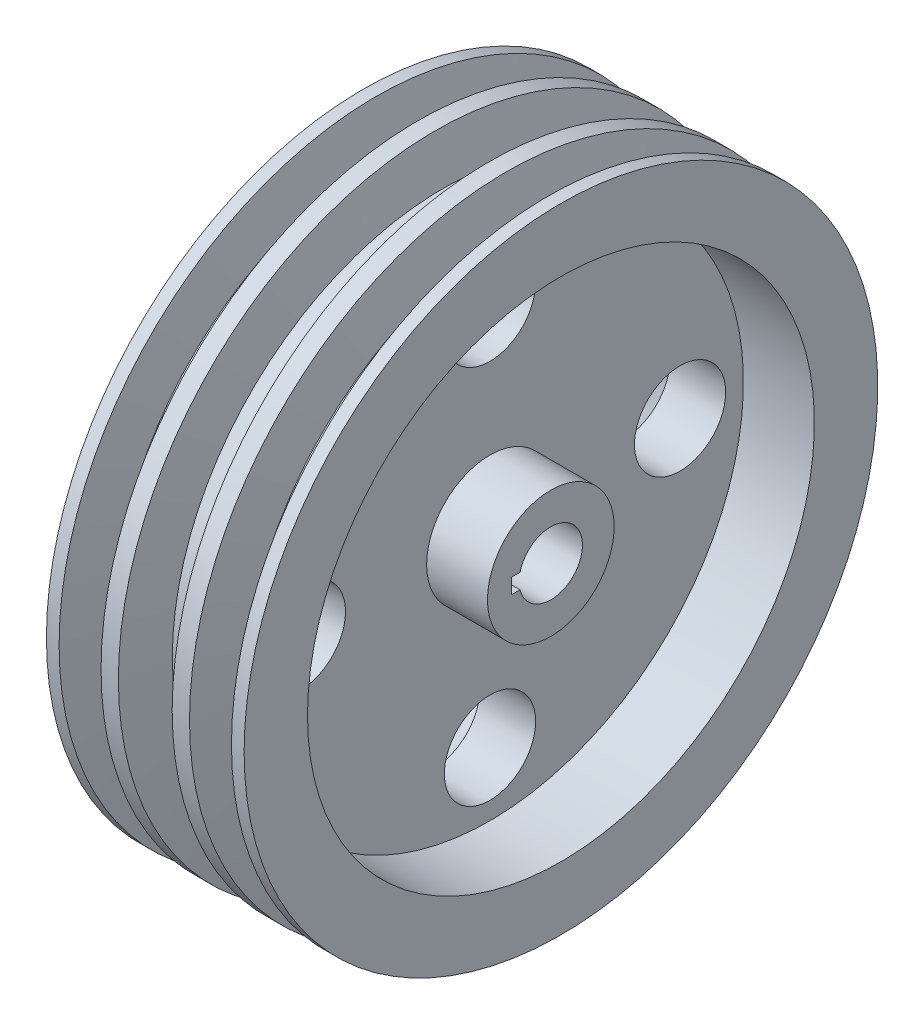
ISO-10303-21;
HEADER;
FILE_DESCRIPTION(('STEP AP214'),'2;1');
FILE_NAME('part.step','',(''),(''),'','','');
FILE_SCHEMA(('AUTOMOTIVE_DESIGN { 1 0 10303 214 1 1 1 1 }'));
ENDSEC;
DATA;
#1=APPLICATION_CONTEXT('core data for automotive mechanical design processes');
#2=APPLICATION_PROTOCOL_DEFINITION('international standard','automotive_design',2000,#1);
#3=PRODUCT_CONTEXT('',#1,'mechanical');
#4=PRODUCT('Part','Part','',(#3));
#5=PRODUCT_RELATED_PRODUCT_CATEGORY('part','',(#4));
#6=PRODUCT_DEFINITION_FORMATION('','',#4);
#7=PRODUCT_DEFINITION_CONTEXT('part definition',#1,'design');
#8=PRODUCT_DEFINITION('design','',#6,#7);
#9=PRODUCT_DEFINITION_SHAPE('','',#8);
#10=(LENGTH_UNIT() NAMED_UNIT(*) SI_UNIT(.MILLI.,.METRE.));
#11=(NAMED_UNIT(*) PLANE_ANGLE_UNIT() SI_UNIT($,.RADIAN.));
#12=(NAMED_UNIT(*) SI_UNIT($,.STERADIAN.) SOLID_ANGLE_UNIT());
#13=UNCERTAINTY_MEASURE_WITH_UNIT(LENGTH_MEASURE(1.E-05),#10,'distance_accuracy_value','');
#14=(GEOMETRIC_REPRESENTATION_CONTEXT(3) GLOBAL_UNCERTAINTY_ASSIGNED_CONTEXT((#13)) GLOBAL_UNIT_ASSIGNED_CONTEXT((#10,
#11,#12)) REPRESENTATION_CONTEXT('',''));
#15=CARTESIAN_POINT('',(0.,0.,0.));
#16=DIRECTION('',(0.,0.,1.));
#17=DIRECTION('',(1.,0.,0.));
#18=AXIS2_PLACEMENT_3D('',#15,#16,#17);
#19=CARTESIAN_POINT('',(17.4485357832083,0.,0.));
#20=DIRECTION('',(-1.,0.,0.));
#21=DIRECTION('',(0.,0.,1.));
#22=AXIS2_PLACEMENT_3D('',#19,#20,#21);
#23=CONICAL_SURFACE('',#22,125.,1.39078123836656);
#24=CARTESIAN_POINT('',(20.7242678916041,0.,0.));
#25=DIRECTION('',(-1.,0.,0.));
#26=DIRECTION('',(0.,0.,1.));
#27=AXIS2_PLACEMENT_3D('',#24,#25,#26);
#28=CIRCLE('',#27,107.);
#29=CARTESIAN_POINT('',(20.7242678916041,0.,107.));
#30=VERTEX_POINT('',#29);
#31=EDGE_CURVE('E105',#30,#30,#28,.T.);
#32=ORIENTED_EDGE('',*,*,#31,.T.);
#33=EDGE_LOOP('',(#32));
#34=FACE_BOUND('',#33,.T.);
#35=CARTESIAN_POINT('',(17.4485357832083,0.,0.));
#36=DIRECTION('',(-1.,0.,0.));
#37=DIRECTION('',(0.,0.,1.));
#38=AXIS2_PLACEMENT_3D('',#35,#36,#37);
#39=CIRCLE('',#38,125.);
#40=CARTESIAN_POINT('',(17.4485357832083,0.,125.));
#41=VERTEX_POINT('',#40);
#42=EDGE_CURVE('E171',#41,#41,#39,.T.);
#43=ORIENTED_EDGE('',*,*,#42,.F.);
#44=EDGE_LOOP('',(#43));
#45=FACE_BOUND('',#44,.T.);
#46=ADVANCED_FACE('F41',(#34,#45),#23,.T.);
#47=CARTESIAN_POINT('',(-121.585294609812,0.,0.));
#48=DIRECTION('',(-1.,0.,0.));
#49=DIRECTION('',(0.,0.,1.));
#50=AXIS2_PLACEMENT_3D('',#47,#48,#49);
#51=CYLINDRICAL_SURFACE('',#50,125.);
#52=ORIENTED_EDGE('',*,*,#42,.T.);
#53=EDGE_LOOP('',(#52));
#54=FACE_BOUND('',#53,.T.);
#55=CARTESIAN_POINT('',(10.6113648581892,0.,0.));
#56=DIRECTION('',(-1.,0.,0.));
#57=DIRECTION('',(0.,0.,1.));
#58=AXIS2_PLACEMENT_3D('',#55,#56,#57);
#59=CIRCLE('',#58,125.);
#60=CARTESIAN_POINT('',(10.6113648581892,0.,125.));
#61=VERTEX_POINT('',#60);
#62=EDGE_CURVE('E166',#61,#61,#59,.T.);
#63=ORIENTED_EDGE('',*,*,#62,.F.);
#64=EDGE_LOOP('',(#63));
#65=FACE_BOUND('',#64,.T.);
#66=ADVANCED_FACE('F228',(#54,#65),#51,.T.);
#67=CARTESIAN_POINT('',(7.33563274979332,0.,0.));
#68=DIRECTION('',(1.,0.,0.));
#69=DIRECTION('',(0.,0.,-1.));
#70=AXIS2_PLACEMENT_3D('',#67,#68,#69);
#71=CONICAL_SURFACE('',#70,107.,1.39078123836655);
#72=ORIENTED_EDGE('',*,*,#62,.T.);
#73=EDGE_LOOP('',(#72));
#74=FACE_BOUND('',#73,.T.);
#75=CARTESIAN_POINT('',(7.33563274979332,0.,0.));
#76=DIRECTION('',(-1.,0.,0.));
#77=DIRECTION('',(0.,0.,1.));
#78=AXIS2_PLACEMENT_3D('',#75,#76,#77);
#79=CIRCLE('',#78,107.);
#80=CARTESIAN_POINT('',(7.33563274979332,0.,107.));
#81=VERTEX_POINT('',#80);
#82=EDGE_CURVE('E167',#81,#81,#79,.T.);
#83=ORIENTED_EDGE('',*,*,#82,.F.);
#84=EDGE_LOOP('',(#83));
#85=FACE_BOUND('',#84,.T.);
#86=ADVANCED_FACE('F233',(#74,#85),#71,.T.);
#87=CARTESIAN_POINT('',(-121.585294609812,0.,0.));
#88=DIRECTION('',(-1.,0.,0.));
#89=DIRECTION('',(0.,0.,1.));
#90=AXIS2_PLACEMENT_3D('',#87,#88,#89);
#91=CYLINDRICAL_SURFACE('',#90,107.);
#92=ORIENTED_EDGE('',*,*,#82,.T.);
#93=EDGE_LOOP('',(#92));
#94=FACE_BOUND('',#93,.T.);
#95=CARTESIAN_POINT('',(-7.33563274979339,0.,0.));
#96=DIRECTION('',(-1.,0.,0.));
#97=DIRECTION('',(0.,0.,1.));
#98=AXIS2_PLACEMENT_3D('',#95,#96,#97);
#99=CIRCLE('',#98,107.);
#100=CARTESIAN_POINT('',(-7.33563274979339,0.,107.));
#101=VERTEX_POINT('',#100);
#102=EDGE_CURVE('E162',#101,#101,#99,.T.);
#103=ORIENTED_EDGE('',*,*,#102,.F.);
#104=EDGE_LOOP('',(#103));
#105=FACE_BOUND('',#104,.T.);
#106=ADVANCED_FACE('F243',(#94,#105),#91,.T.);
#107=CARTESIAN_POINT('',(-7.33563274979339,0.,0.));
#108=DIRECTION('',(-1.,0.,0.));
#109=DIRECTION('',(0.,0.,1.));
#110=AXIS2_PLACEMENT_3D('',#107,#108,#109);
#111=CONICAL_SURFACE('',#110,107.,1.39078123836656);
#112=CARTESIAN_POINT('',(-10.6113648581892,0.,0.));
#113=DIRECTION('',(-1.,0.,0.));
#114=DIRECTION('',(0.,0.,1.));
#115=AXIS2_PLACEMENT_3D('',#112,#113,#114);
#116=CIRCLE('',#115,125.);
#117=CARTESIAN_POINT('',(-10.6113648581892,0.,125.));
#118=VERTEX_POINT('',#117);
#119=EDGE_CURVE('E159',#118,#118,#116,.T.);
#120=ORIENTED_EDGE('',*,*,#119,.F.);
#121=EDGE_LOOP('',(#120));
#122=FACE_BOUND('',#121,.T.);
#123=ORIENTED_EDGE('',*,*,#102,.T.);
#124=EDGE_LOOP('',(#123));
#125=FACE_BOUND('',#124,.T.);
#126=ADVANCED_FACE('F250',(#122,#125),#111,.T.);
#127=CARTESIAN_POINT('',(-121.585294609812,0.,0.));
#128=DIRECTION('',(-1.,0.,0.));
#129=DIRECTION('',(0.,0.,1.));
#130=AXIS2_PLACEMENT_3D('',#127,#128,#129);
#131=CYLINDRICAL_SURFACE('',#130,125.);
#132=CARTESIAN_POINT('',(-17.4485357832083,0.,0.));
#133=DIRECTION('',(-1.,0.,0.));
#134=DIRECTION('',(0.,0.,1.));
#135=AXIS2_PLACEMENT_3D('',#132,#133,#134);
#136=CIRCLE('',#135,125.);
#137=CARTESIAN_POINT('',(-17.4485357832083,0.,125.));
#138=VERTEX_POINT('',#137);
#139=EDGE_CURVE('E160',#138,#138,#136,.T.);
#140=ORIENTED_EDGE('',*,*,#139,.F.);
#141=EDGE_LOOP('',(#140));
#142=FACE_BOUND('',#141,.T.);
#143=ORIENTED_EDGE('',*,*,#119,.T.);
#144=EDGE_LOOP('',(#143));
#145=FACE_BOUND('',#144,.T.);
#146=ADVANCED_FACE('F254',(#142,#145),#131,.T.);
#147=CARTESIAN_POINT('',(-17.4485357832083,0.,0.));
#148=DIRECTION('',(1.,0.,0.));
#149=DIRECTION('',(0.,0.,-1.));
#150=AXIS2_PLACEMENT_3D('',#147,#148,#149);
#151=CONICAL_SURFACE('',#150,125.,1.39078123836656);
#152=CARTESIAN_POINT('',(-20.7242678916041,0.,0.));
#153=DIRECTION('',(-1.,0.,0.));
#154=DIRECTION('',(0.,0.,1.));
#155=AXIS2_PLACEMENT_3D('',#152,#153,#154);
#156=CIRCLE('',#155,107.);
#157=CARTESIAN_POINT('',(-20.7242678916041,0.,107.));
#158=VERTEX_POINT('',#157);
#159=EDGE_CURVE('E152',#158,#158,#156,.T.);
#160=ORIENTED_EDGE('',*,*,#159,.F.);
#161=EDGE_LOOP('',(#160));
#162=FACE_BOUND('',#161,.T.);
#163=ORIENTED_EDGE('',*,*,#139,.T.);
#164=EDGE_LOOP('',(#163));
#165=FACE_BOUND('',#164,.T.);
#166=ADVANCED_FACE('F261',(#162,#165),#151,.T.);
#167=CARTESIAN_POINT('',(-121.585294609812,0.,0.));
#168=DIRECTION('',(-1.,0.,0.));
#169=DIRECTION('',(0.,0.,1.));
#170=AXIS2_PLACEMENT_3D('',#167,#168,#169);
#171=CYLINDRICAL_SURFACE('',#170,107.);
#172=CARTESIAN_POINT('',(-30.7242678916041,0.,0.));
#173=DIRECTION('',(-1.,0.,0.));
#174=DIRECTION('',(0.,0.,1.));
#175=AXIS2_PLACEMENT_3D('',#172,#173,#174);
#176=CIRCLE('',#175,107.);
#177=CARTESIAN_POINT('',(-30.7242678916041,0.,107.));
#178=VERTEX_POINT('',#177);
#179=EDGE_CURVE('E151',#178,#178,#176,.T.);
#180=ORIENTED_EDGE('',*,*,#179,.F.);
#181=EDGE_LOOP('',(#180));
#182=FACE_BOUND('',#181,.T.);
#183=ORIENTED_EDGE('',*,*,#159,.T.);
#184=EDGE_LOOP('',(#183));
#185=FACE_BOUND('',#184,.T.);
#186=ADVANCED_FACE('F268',(#182,#185),#171,.T.);
#187=CARTESIAN_POINT('',(-30.7242678916041,0.,0.));
#188=DIRECTION('',(-1.,0.,0.));
#189=DIRECTION('',(0.,0.,1.));
#190=AXIS2_PLACEMENT_3D('',#187,#188,#189);
#191=CONICAL_SURFACE('',#190,107.,1.39078123836655);
#192=CARTESIAN_POINT('',(-34.,0.,0.));
#193=DIRECTION('',(-1.,0.,0.));
#194=DIRECTION('',(0.,0.,1.));
#195=AXIS2_PLACEMENT_3D('',#192,#193,#194);
#196=CIRCLE('',#195,125.);
#197=CARTESIAN_POINT('',(-34.,0.,125.));
#198=VERTEX_POINT('',#197);
#199=EDGE_CURVE('E146',#198,#198,#196,.T.);
#200=ORIENTED_EDGE('',*,*,#199,.F.);
#201=EDGE_LOOP('',(#200));
#202=FACE_BOUND('',#201,.T.);
#203=ORIENTED_EDGE('',*,*,#179,.T.);
#204=EDGE_LOOP('',(#203));
#205=FACE_BOUND('',#204,.T.);
#206=ADVANCED_FACE('F275',(#202,#205),#191,.T.);
#207=CARTESIAN_POINT('',(-121.585294609812,0.,0.));
#208=DIRECTION('',(-1.,0.,0.));
#209=DIRECTION('',(0.,0.,1.));
#210=AXIS2_PLACEMENT_3D('',#207,#208,#209);
#211=CYLINDRICAL_SURFACE('',#210,125.);
#212=CARTESIAN_POINT('',(-39.,0.,0.));
#213=DIRECTION('',(-1.,0.,0.));
#214=DIRECTION('',(0.,0.,1.));
#215=AXIS2_PLACEMENT_3D('',#212,#213,#214);
#216=CIRCLE('',#215,125.);
#217=CARTESIAN_POINT('',(-39.,0.,125.));
#218=VERTEX_POINT('',#217);
#219=EDGE_CURVE('E144',#218,#218,#216,.T.);
#220=ORIENTED_EDGE('',*,*,#219,.F.);
#221=EDGE_LOOP('',(#220));
#222=FACE_BOUND('',#221,.T.);
#223=ORIENTED_EDGE('',*,*,#199,.T.);
#224=EDGE_LOOP('',(#223));
#225=FACE_BOUND('',#224,.T.);
#226=ADVANCED_FACE('F277',(#222,#225),#211,.T.);
#227=CARTESIAN_POINT('',(-39.,0.,0.));
#228=DIRECTION('',(1.,0.,0.));
#229=DIRECTION('',(0.,0.,-1.));
#230=AXIS2_PLACEMENT_3D('',#227,#228,#229);
#231=PLANE('',#230);
#232=CARTESIAN_POINT('',(-39.,0.,0.));
#233=DIRECTION('',(-1.,0.,0.));
#234=DIRECTION('',(0.,0.,1.));
#235=AXIS2_PLACEMENT_3D('',#232,#233,#234);
#236=CIRCLE('',#235,100.);
#237=CARTESIAN_POINT('',(-39.,0.,100.));
#238=VERTEX_POINT('',#237);
#239=EDGE_CURVE('E142',#238,#238,#236,.T.);
#240=ORIENTED_EDGE('',*,*,#239,.F.);
#241=EDGE_LOOP('',(#240));
#242=FACE_BOUND('',#241,.T.);
#243=ORIENTED_EDGE('',*,*,#219,.T.);
#244=EDGE_LOOP('',(#243));
#245=FACE_BOUND('',#244,.T.);
#246=ADVANCED_FACE('F278',(#242,#245),#231,.F.);
#247=CARTESIAN_POINT('',(-121.585294609812,0.,0.));
#248=DIRECTION('',(-1.,0.,0.));
#249=DIRECTION('',(0.,0.,1.));
#250=AXIS2_PLACEMENT_3D('',#247,#248,#249);
#251=CYLINDRICAL_SURFACE('',#250,100.);
#252=CARTESIAN_POINT('',(-11.,0.,0.));
#253=DIRECTION('',(-1.,0.,0.));
#254=DIRECTION('',(0.,0.,1.));
#255=AXIS2_PLACEMENT_3D('',#252,#253,#254);
#256=CIRCLE('',#255,100.);
#257=CARTESIAN_POINT('',(-11.,0.,100.));
#258=VERTEX_POINT('',#257);
#259=EDGE_CURVE('E138',#258,#258,#256,.T.);
#260=ORIENTED_EDGE('',*,*,#259,.F.);
#261=EDGE_LOOP('',(#260));
#262=FACE_BOUND('',#261,.T.);
#263=ORIENTED_EDGE('',*,*,#239,.T.);
#264=EDGE_LOOP('',(#263));
#265=FACE_BOUND('',#264,.T.);
#266=ADVANCED_FACE('F283',(#262,#265),#251,.F.);
#267=CARTESIAN_POINT('',(-11.,0.,0.));
#268=DIRECTION('',(1.,0.,0.));
#269=DIRECTION('',(0.,0.,-1.));
#270=AXIS2_PLACEMENT_3D('',#267,#268,#269);
#271=PLANE('',#270);
#272=CARTESIAN_POINT('',(-11.,75.,0.));
#273=DIRECTION('',(1.,0.,0.));
#274=DIRECTION('',(0.,0.,-1.));
#275=AXIS2_PLACEMENT_3D('',#272,#273,#274);
#276=CIRCLE('',#275,18.);
#277=CARTESIAN_POINT('',(-11.,75.,-18.));
#278=VERTEX_POINT('',#277);
#279=EDGE_CURVE('E88',#278,#278,#276,.T.);
#280=ORIENTED_EDGE('',*,*,#279,.T.);
#281=EDGE_LOOP('',(#280));
#282=FACE_BOUND('',#281,.T.);
#283=CARTESIAN_POINT('',(-11.,7.85583301239705E-13,-75.));
#284=DIRECTION('',(1.,0.,0.));
#285=DIRECTION('',(0.,0.,-1.));
#286=AXIS2_PLACEMENT_3D('',#283,#284,#285);
#287=CIRCLE('',#286,18.);
#288=CARTESIAN_POINT('',(-11.,7.85583301239705E-13,-93.));
#289=VERTEX_POINT('',#288);
#290=EDGE_CURVE('E186',#289,#289,#287,.T.);
#291=ORIENTED_EDGE('',*,*,#290,.T.);
#292=EDGE_LOOP('',(#291));
#293=FACE_BOUND('',#292,.T.);
#294=CARTESIAN_POINT('',(-11.,-75.,-5.2372220082647E-13));
#295=DIRECTION('',(1.,0.,0.));
#296=DIRECTION('',(0.,0.,-1.));
#297=AXIS2_PLACEMENT_3D('',#294,#295,#296);
#298=CIRCLE('',#297,18.);
#299=CARTESIAN_POINT('',(-11.,-75.,-18.0000000000005));
#300=VERTEX_POINT('',#299);
#301=EDGE_CURVE('E181',#300,#300,#298,.T.);
#302=ORIENTED_EDGE('',*,*,#301,.T.);
#303=EDGE_LOOP('',(#302));
#304=FACE_BOUND('',#303,.T.);
#305=CARTESIAN_POINT('',(-11.,-2.61861100413235E-13,75.));
#306=DIRECTION('',(1.,0.,0.));
#307=DIRECTION('',(0.,0.,-1.));
#308=AXIS2_PLACEMENT_3D('',#305,#306,#307);
#309=CIRCLE('',#308,18.);
#310=CARTESIAN_POINT('',(-11.,-2.61861100413235E-13,57.));
#311=VERTEX_POINT('',#310);
#312=EDGE_CURVE('E178',#311,#311,#309,.T.);
#313=ORIENTED_EDGE('',*,*,#312,.T.);
#314=EDGE_LOOP('',(#313));
#315=FACE_BOUND('',#314,.T.);
#316=CARTESIAN_POINT('',(-11.,0.,0.));
#317=DIRECTION('',(-1.,0.,0.));
#318=DIRECTION('',(0.,0.,1.));
#319=AXIS2_PLACEMENT_3D('',#316,#317,#318);
#320=CIRCLE('',#319,25.);
#321=CARTESIAN_POINT('',(-11.,0.,25.));
#322=VERTEX_POINT('',#321);
#323=EDGE_CURVE('E136',#322,#322,#320,.T.);
#324=ORIENTED_EDGE('',*,*,#323,.F.);
#325=EDGE_LOOP('',(#324));
#326=FACE_BOUND('',#325,.T.);
#327=ORIENTED_EDGE('',*,*,#259,.T.);
#328=EDGE_LOOP('',(#327));
#329=FACE_BOUND('',#328,.T.);
#330=ADVANCED_FACE('F211',(#282,#293,#304,#315,#326,#329),#271,.F.);
#331=CARTESIAN_POINT('',(-121.585294609812,0.,0.));
#332=DIRECTION('',(-1.,0.,0.));
#333=DIRECTION('',(0.,0.,1.));
#334=AXIS2_PLACEMENT_3D('',#331,#332,#333);
#335=CYLINDRICAL_SURFACE('',#334,25.);
#336=CARTESIAN_POINT('',(-35.,0.,0.));
#337=DIRECTION('',(-1.,0.,0.));
#338=DIRECTION('',(0.,0.,1.));
#339=AXIS2_PLACEMENT_3D('',#336,#337,#338);
#340=CIRCLE('',#339,25.);
#341=CARTESIAN_POINT('',(-35.,0.,25.));
#342=VERTEX_POINT('',#341);
#343=EDGE_CURVE('E135',#342,#342,#340,.T.);
#344=ORIENTED_EDGE('',*,*,#343,.F.);
#345=EDGE_LOOP('',(#344));
#346=FACE_BOUND('',#345,.T.);
#347=ORIENTED_EDGE('',*,*,#323,.T.);
#348=EDGE_LOOP('',(#347));
#349=FACE_BOUND('',#348,.T.);
#350=ADVANCED_FACE('F292',(#346,#349),#335,.T.);
#351=CARTESIAN_POINT('',(-35.,0.,0.));
#352=DIRECTION('',(1.,0.,0.));
#353=DIRECTION('',(0.,0.,-1.));
#354=AXIS2_PLACEMENT_3D('',#351,#352,#353);
#355=PLANE('',#354);
#356=DIRECTION('',(0.,-1.,0.));
#357=VECTOR('',#356,1.);
#358=CARTESIAN_POINT('',(-35.,0.,15.5));
#359=LINE('',#358,#357);
#360=CARTESIAN_POINT('',(-35.,3.,15.5));
#361=VERTEX_POINT('',#360);
#362=CARTESIAN_POINT('',(-35.,-3.,15.5));
#363=VERTEX_POINT('',#362);
#364=EDGE_CURVE('E78',#361,#363,#359,.T.);
#365=ORIENTED_EDGE('',*,*,#364,.T.);
#366=DIRECTION('',(0.,0.,-1.));
#367=VECTOR('',#366,1.);
#368=CARTESIAN_POINT('',(-35.,-3.,0.));
#369=LINE('',#368,#367);
#370=CARTESIAN_POINT('',(-35.,-3.,12.1346610995116));
#371=VERTEX_POINT('',#370);
#372=EDGE_CURVE('E99',#363,#371,#369,.T.);
#373=ORIENTED_EDGE('',*,*,#372,.T.);
#374=CARTESIAN_POINT('',(-35.,0.,0.));
#375=DIRECTION('',(-1.,0.,0.));
#376=DIRECTION('',(0.,0.,1.));
#377=AXIS2_PLACEMENT_3D('',#374,#375,#376);
#378=CIRCLE('',#377,12.5);
#379=CARTESIAN_POINT('',(-35.,3.,12.1346610995116));
#380=VERTEX_POINT('',#379);
#381=EDGE_CURVE('E97',#380,#371,#378,.T.);
#382=ORIENTED_EDGE('',*,*,#381,.F.);
#383=DIRECTION('',(0.,0.,1.));
#384=VECTOR('',#383,1.);
#385=CARTESIAN_POINT('',(-35.,3.,0.));
#386=LINE('',#385,#384);
#387=EDGE_CURVE('E85',#380,#361,#386,.T.);
#388=ORIENTED_EDGE('',*,*,#387,.T.);
#389=EDGE_LOOP('',(#365,#373,#382,#388));
#390=FACE_BOUND('',#389,.T.);
#391=ORIENTED_EDGE('',*,*,#343,.T.);
#392=EDGE_LOOP('',(#391));
#393=FACE_BOUND('',#392,.T.);
#394=ADVANCED_FACE('F96',(#390,#393),#355,.F.);
#395=CARTESIAN_POINT('',(-121.585294609812,0.,0.));
#396=DIRECTION('',(-1.,0.,0.));
#397=DIRECTION('',(0.,0.,1.));
#398=AXIS2_PLACEMENT_3D('',#395,#396,#397);
#399=CYLINDRICAL_SURFACE('',#398,12.5);
#400=DIRECTION('',(-1.,0.,0.));
#401=VECTOR('',#400,1.);
#402=CARTESIAN_POINT('',(39.,-3.,12.1346610995116));
#403=LINE('',#402,#401);
#404=CARTESIAN_POINT('',(35.,-3.,12.1346610995116));
#405=VERTEX_POINT('',#404);
#406=EDGE_CURVE('E61',#405,#371,#403,.T.);
#407=ORIENTED_EDGE('',*,*,#406,.F.);
#408=CARTESIAN_POINT('',(35.,0.,0.));
#409=DIRECTION('',(-1.,0.,0.));
#410=DIRECTION('',(0.,0.,1.));
#411=AXIS2_PLACEMENT_3D('',#408,#409,#410);
#412=CIRCLE('',#411,12.5);
#413=CARTESIAN_POINT('',(35.,3.,12.1346610995116));
#414=VERTEX_POINT('',#413);
#415=EDGE_CURVE('E129',#414,#405,#412,.T.);
#416=ORIENTED_EDGE('',*,*,#415,.F.);
#417=DIRECTION('',(-1.,0.,0.));
#418=VECTOR('',#417,1.);
#419=CARTESIAN_POINT('',(39.,3.,12.1346610995116));
#420=LINE('',#419,#418);
#421=EDGE_CURVE('E91',#414,#380,#420,.T.);
#422=ORIENTED_EDGE('',*,*,#421,.T.);
#423=ORIENTED_EDGE('',*,*,#381,.T.);
#424=EDGE_LOOP('',(#407,#416,#422,#423));
#425=FACE_BOUND('',#424,.T.);
#426=ADVANCED_FACE('F200',(#425),#399,.F.);
#427=CARTESIAN_POINT('',(35.,0.,0.));
#428=DIRECTION('',(1.,0.,0.));
#429=DIRECTION('',(0.,0.,-1.));
#430=AXIS2_PLACEMENT_3D('',#427,#428,#429);
#431=PLANE('',#430);
#432=DIRECTION('',(0.,0.,-1.));
#433=VECTOR('',#432,1.);
#434=CARTESIAN_POINT('',(35.,-3.,0.));
#435=LINE('',#434,#433);
#436=CARTESIAN_POINT('',(35.,-3.,15.5));
#437=VERTEX_POINT('',#436);
#438=EDGE_CURVE('E11',#437,#405,#435,.T.);
#439=ORIENTED_EDGE('',*,*,#438,.F.);
#440=DIRECTION('',(0.,-1.,0.));
#441=VECTOR('',#440,1.);
#442=CARTESIAN_POINT('',(35.,0.,15.5));
#443=LINE('',#442,#441);
#444=CARTESIAN_POINT('',(35.,3.,15.5));
#445=VERTEX_POINT('',#444);
#446=EDGE_CURVE('E172',#445,#437,#443,.T.);
#447=ORIENTED_EDGE('',*,*,#446,.F.);
#448=DIRECTION('',(0.,0.,1.));
#449=VECTOR('',#448,1.);
#450=CARTESIAN_POINT('',(35.,3.,0.));
#451=LINE('',#450,#449);
#452=EDGE_CURVE('E48',#414,#445,#451,.T.);
#453=ORIENTED_EDGE('',*,*,#452,.F.);
#454=ORIENTED_EDGE('',*,*,#415,.T.);
#455=EDGE_LOOP('',(#439,#447,#453,#454));
#456=FACE_BOUND('',#455,.T.);
#457=CARTESIAN_POINT('',(35.,0.,0.));
#458=DIRECTION('',(-1.,0.,0.));
#459=DIRECTION('',(0.,0.,1.));
#460=AXIS2_PLACEMENT_3D('',#457,#458,#459);
#461=CIRCLE('',#460,25.);
#462=CARTESIAN_POINT('',(35.,0.,25.));
#463=VERTEX_POINT('',#462);
#464=EDGE_CURVE('E127',#463,#463,#461,.T.);
#465=ORIENTED_EDGE('',*,*,#464,.F.);
#466=EDGE_LOOP('',(#465));
#467=FACE_BOUND('',#466,.T.);
#468=ADVANCED_FACE('F195',(#456,#467),#431,.T.);
#469=CARTESIAN_POINT('',(-121.585294609812,0.,0.));
#470=DIRECTION('',(-1.,0.,0.));
#471=DIRECTION('',(0.,0.,1.));
#472=AXIS2_PLACEMENT_3D('',#469,#470,#471);
#473=CYLINDRICAL_SURFACE('',#472,25.);
#474=ORIENTED_EDGE('',*,*,#464,.T.);
#475=EDGE_LOOP('',(#474));
#476=FACE_BOUND('',#475,.T.);
#477=CARTESIAN_POINT('',(11.,0.,0.));
#478=DIRECTION('',(-1.,0.,0.));
#479=DIRECTION('',(0.,0.,1.));
#480=AXIS2_PLACEMENT_3D('',#477,#478,#479);
#481=CIRCLE('',#480,25.);
#482=CARTESIAN_POINT('',(11.,0.,25.));
#483=VERTEX_POINT('',#482);
#484=EDGE_CURVE('E124',#483,#483,#481,.T.);
#485=ORIENTED_EDGE('',*,*,#484,.F.);
#486=EDGE_LOOP('',(#485));
#487=FACE_BOUND('',#486,.T.);
#488=ADVANCED_FACE('F301',(#476,#487),#473,.T.);
#489=CARTESIAN_POINT('',(11.,0.,0.));
#490=DIRECTION('',(1.,0.,0.));
#491=DIRECTION('',(0.,0.,-1.));
#492=AXIS2_PLACEMENT_3D('',#489,#490,#491);
#493=PLANE('',#492);
#494=CARTESIAN_POINT('',(11.,75.,0.));
#495=DIRECTION('',(1.,0.,0.));
#496=DIRECTION('',(0.,0.,-1.));
#497=AXIS2_PLACEMENT_3D('',#494,#495,#496);
#498=CIRCLE('',#497,18.);
#499=CARTESIAN_POINT('',(11.,75.,-18.));
#500=VERTEX_POINT('',#499);
#501=EDGE_CURVE('E190',#500,#500,#498,.T.);
#502=ORIENTED_EDGE('',*,*,#501,.F.);
#503=EDGE_LOOP('',(#502));
#504=FACE_BOUND('',#503,.T.);
#505=CARTESIAN_POINT('',(11.,7.85583301239705E-13,-75.));
#506=DIRECTION('',(1.,0.,0.));
#507=DIRECTION('',(0.,0.,-1.));
#508=AXIS2_PLACEMENT_3D('',#505,#506,#507);
#509=CIRCLE('',#508,18.);
#510=CARTESIAN_POINT('',(11.,7.85583301239705E-13,-93.));
#511=VERTEX_POINT('',#510);
#512=EDGE_CURVE('E184',#511,#511,#509,.T.);
#513=ORIENTED_EDGE('',*,*,#512,.F.);
#514=EDGE_LOOP('',(#513));
#515=FACE_BOUND('',#514,.T.);
#516=CARTESIAN_POINT('',(11.,-75.,-5.2372220082647E-13));
#517=DIRECTION('',(1.,0.,0.));
#518=DIRECTION('',(0.,0.,-1.));
#519=AXIS2_PLACEMENT_3D('',#516,#517,#518);
#520=CIRCLE('',#519,18.);
#521=CARTESIAN_POINT('',(11.,-75.,-18.0000000000005));
#522=VERTEX_POINT('',#521);
#523=EDGE_CURVE('E180',#522,#522,#520,.T.);
#524=ORIENTED_EDGE('',*,*,#523,.F.);
#525=EDGE_LOOP('',(#524));
#526=FACE_BOUND('',#525,.T.);
#527=CARTESIAN_POINT('',(11.,-2.61861100413235E-13,75.));
#528=DIRECTION('',(1.,0.,0.));
#529=DIRECTION('',(0.,0.,-1.));
#530=AXIS2_PLACEMENT_3D('',#527,#528,#529);
#531=CIRCLE('',#530,18.);
#532=CARTESIAN_POINT('',(11.,-2.61861100413235E-13,57.));
#533=VERTEX_POINT('',#532);
#534=EDGE_CURVE('E176',#533,#533,#531,.T.);
#535=ORIENTED_EDGE('',*,*,#534,.F.);
#536=EDGE_LOOP('',(#535));
#537=FACE_BOUND('',#536,.T.);
#538=ORIENTED_EDGE('',*,*,#484,.T.);
#539=EDGE_LOOP('',(#538));
#540=FACE_BOUND('',#539,.T.);
#541=CARTESIAN_POINT('',(11.,0.,0.));
#542=DIRECTION('',(-1.,0.,0.));
#543=DIRECTION('',(0.,0.,1.));
#544=AXIS2_PLACEMENT_3D('',#541,#542,#543);
#545=CIRCLE('',#544,100.);
#546=CARTESIAN_POINT('',(11.,0.,100.));
#547=VERTEX_POINT('',#546);
#548=EDGE_CURVE('E117',#547,#547,#545,.T.);
#549=ORIENTED_EDGE('',*,*,#548,.F.);
#550=EDGE_LOOP('',(#549));
#551=FACE_BOUND('',#550,.T.);
#552=ADVANCED_FACE('F303',(#504,#515,#526,#537,#540,#551),#493,.T.);
#553=CARTESIAN_POINT('',(-121.585294609812,0.,0.));
#554=DIRECTION('',(-1.,0.,0.));
#555=DIRECTION('',(0.,0.,1.));
#556=AXIS2_PLACEMENT_3D('',#553,#554,#555);
#557=CYLINDRICAL_SURFACE('',#556,100.);
#558=ORIENTED_EDGE('',*,*,#548,.T.);
#559=EDGE_LOOP('',(#558));
#560=FACE_BOUND('',#559,.T.);
#561=CARTESIAN_POINT('',(39.,0.,0.));
#562=DIRECTION('',(-1.,0.,0.));
#563=DIRECTION('',(0.,0.,1.));
#564=AXIS2_PLACEMENT_3D('',#561,#562,#563);
#565=CIRCLE('',#564,100.);
#566=CARTESIAN_POINT('',(39.,0.,100.));
#567=VERTEX_POINT('',#566);
#568=EDGE_CURVE('E116',#567,#567,#565,.T.);
#569=ORIENTED_EDGE('',*,*,#568,.F.);
#570=EDGE_LOOP('',(#569));
#571=FACE_BOUND('',#570,.T.);
#572=ADVANCED_FACE('F306',(#560,#571),#557,.F.);
#573=CARTESIAN_POINT('',(39.,0.,0.));
#574=DIRECTION('',(1.,0.,0.));
#575=DIRECTION('',(0.,0.,-1.));
#576=AXIS2_PLACEMENT_3D('',#573,#574,#575);
#577=PLANE('',#576);
#578=ORIENTED_EDGE('',*,*,#568,.T.);
#579=EDGE_LOOP('',(#578));
#580=FACE_BOUND('',#579,.T.);
#581=CARTESIAN_POINT('',(39.,0.,0.));
#582=DIRECTION('',(-1.,0.,0.));
#583=DIRECTION('',(0.,0.,1.));
#584=AXIS2_PLACEMENT_3D('',#581,#582,#583);
#585=CIRCLE('',#584,125.);
#586=CARTESIAN_POINT('',(39.,0.,125.));
#587=VERTEX_POINT('',#586);
#588=EDGE_CURVE('E111',#587,#587,#585,.T.);
#589=ORIENTED_EDGE('',*,*,#588,.F.);
#590=EDGE_LOOP('',(#589));
#591=FACE_BOUND('',#590,.T.);
#592=ADVANCED_FACE('F315',(#580,#591),#577,.T.);
#593=CARTESIAN_POINT('',(-121.585294609812,0.,0.));
#594=DIRECTION('',(-1.,0.,0.));
#595=DIRECTION('',(0.,0.,1.));
#596=AXIS2_PLACEMENT_3D('',#593,#594,#595);
#597=CYLINDRICAL_SURFACE('',#596,125.);
#598=ORIENTED_EDGE('',*,*,#588,.T.);
#599=EDGE_LOOP('',(#598));
#600=FACE_BOUND('',#599,.T.);
#601=CARTESIAN_POINT('',(34.,0.,0.));
#602=DIRECTION('',(-1.,0.,0.));
#603=DIRECTION('',(0.,0.,1.));
#604=AXIS2_PLACEMENT_3D('',#601,#602,#603);
#605=CIRCLE('',#604,125.);
#606=CARTESIAN_POINT('',(34.,0.,125.));
#607=VERTEX_POINT('',#606);
#608=EDGE_CURVE('E112',#607,#607,#605,.T.);
#609=ORIENTED_EDGE('',*,*,#608,.F.);
#610=EDGE_LOOP('',(#609));
#611=FACE_BOUND('',#610,.T.);
#612=ADVANCED_FACE('F316',(#600,#611),#597,.T.);
#613=CARTESIAN_POINT('',(30.7242678916041,0.,0.));
#614=DIRECTION('',(1.,0.,0.));
#615=DIRECTION('',(0.,0.,-1.));
#616=AXIS2_PLACEMENT_3D('',#613,#614,#615);
#617=CONICAL_SURFACE('',#616,107.,1.39078123836655);
#618=ORIENTED_EDGE('',*,*,#608,.T.);
#619=EDGE_LOOP('',(#618));
#620=FACE_BOUND('',#619,.T.);
#621=CARTESIAN_POINT('',(30.7242678916041,0.,0.));
#622=DIRECTION('',(-1.,0.,0.));
#623=DIRECTION('',(0.,0.,1.));
#624=AXIS2_PLACEMENT_3D('',#621,#622,#623);
#625=CIRCLE('',#624,107.);
#626=CARTESIAN_POINT('',(30.7242678916041,0.,107.));
#627=VERTEX_POINT('',#626);
#628=EDGE_CURVE('E107',#627,#627,#625,.T.);
#629=ORIENTED_EDGE('',*,*,#628,.F.);
#630=EDGE_LOOP('',(#629));
#631=FACE_BOUND('',#630,.T.);
#632=ADVANCED_FACE('F319',(#620,#631),#617,.T.);
#633=CARTESIAN_POINT('',(-121.585294609812,0.,0.));
#634=DIRECTION('',(-1.,0.,0.));
#635=DIRECTION('',(0.,0.,1.));
#636=AXIS2_PLACEMENT_3D('',#633,#634,#635);
#637=CYLINDRICAL_SURFACE('',#636,107.);
#638=ORIENTED_EDGE('',*,*,#628,.T.);
#639=EDGE_LOOP('',(#638));
#640=FACE_BOUND('',#639,.T.);
#641=ORIENTED_EDGE('',*,*,#31,.F.);
#642=EDGE_LOOP('',(#641));
#643=FACE_BOUND('',#642,.T.);
#644=ADVANCED_FACE('F322',(#640,#643),#637,.T.);
#645=CARTESIAN_POINT('',(39.,-2.61861100413235E-13,75.));
#646=DIRECTION('',(-1.,0.,0.));
#647=DIRECTION('',(0.,0.,1.));
#648=AXIS2_PLACEMENT_3D('',#645,#646,#647);
#649=CYLINDRICAL_SURFACE('',#648,18.);
#650=ORIENTED_EDGE('',*,*,#534,.T.);
#651=EDGE_LOOP('',(#650));
#652=FACE_BOUND('',#651,.T.);
#653=ORIENTED_EDGE('',*,*,#312,.F.);
#654=EDGE_LOOP('',(#653));
#655=FACE_BOUND('',#654,.T.);
#656=ADVANCED_FACE('F327',(#652,#655),#649,.F.);
#657=CARTESIAN_POINT('',(39.,-75.,-5.2372220082647E-13));
#658=DIRECTION('',(-1.,0.,0.));
#659=DIRECTION('',(0.,0.,1.));
#660=AXIS2_PLACEMENT_3D('',#657,#658,#659);
#661=CYLINDRICAL_SURFACE('',#660,18.);
#662=ORIENTED_EDGE('',*,*,#523,.T.);
#663=EDGE_LOOP('',(#662));
#664=FACE_BOUND('',#663,.T.);
#665=ORIENTED_EDGE('',*,*,#301,.F.);
#666=EDGE_LOOP('',(#665));
#667=FACE_BOUND('',#666,.T.);
#668=ADVANCED_FACE('F221',(#664,#667),#661,.F.);
#669=CARTESIAN_POINT('',(39.,7.85583301239705E-13,-75.));
#670=DIRECTION('',(-1.,0.,0.));
#671=DIRECTION('',(0.,0.,1.));
#672=AXIS2_PLACEMENT_3D('',#669,#670,#671);
#673=CYLINDRICAL_SURFACE('',#672,18.);
#674=ORIENTED_EDGE('',*,*,#512,.T.);
#675=EDGE_LOOP('',(#674));
#676=FACE_BOUND('',#675,.T.);
#677=ORIENTED_EDGE('',*,*,#290,.F.);
#678=EDGE_LOOP('',(#677));
#679=FACE_BOUND('',#678,.T.);
#680=ADVANCED_FACE('F216',(#676,#679),#673,.F.);
#681=CARTESIAN_POINT('',(39.,75.,0.));
#682=DIRECTION('',(-1.,0.,0.));
#683=DIRECTION('',(0.,0.,1.));
#684=AXIS2_PLACEMENT_3D('',#681,#682,#683);
#685=CYLINDRICAL_SURFACE('',#684,18.);
#686=ORIENTED_EDGE('',*,*,#501,.T.);
#687=EDGE_LOOP('',(#686));
#688=FACE_BOUND('',#687,.T.);
#689=ORIENTED_EDGE('',*,*,#279,.F.);
#690=EDGE_LOOP('',(#689));
#691=FACE_BOUND('',#690,.T.);
#692=ADVANCED_FACE('F212',(#688,#691),#685,.F.);
#693=CARTESIAN_POINT('',(39.,-3.,15.5));
#694=DIRECTION('',(0.,-1.,0.));
#695=DIRECTION('',(0.,0.,-1.));
#696=AXIS2_PLACEMENT_3D('',#693,#694,#695);
#697=PLANE('',#696);
#698=DIRECTION('',(-1.,0.,0.));
#699=VECTOR('',#698,1.);
#700=CARTESIAN_POINT('',(39.,-3.,15.5));
#701=LINE('',#700,#699);
#702=EDGE_CURVE('E82',#437,#363,#701,.T.);
#703=ORIENTED_EDGE('',*,*,#702,.F.);
#704=ORIENTED_EDGE('',*,*,#438,.T.);
#705=ORIENTED_EDGE('',*,*,#406,.T.);
#706=ORIENTED_EDGE('',*,*,#372,.F.);
#707=EDGE_LOOP('',(#703,#704,#705,#706));
#708=FACE_BOUND('',#707,.T.);
#709=ADVANCED_FACE('F194',(#708),#697,.F.);
#710=CARTESIAN_POINT('',(39.,3.,15.5));
#711=DIRECTION('',(0.,1.,0.));
#712=DIRECTION('',(0.,0.,1.));
#713=AXIS2_PLACEMENT_3D('',#710,#711,#712);
#714=PLANE('',#713);
#715=ORIENTED_EDGE('',*,*,#421,.F.);
#716=ORIENTED_EDGE('',*,*,#452,.T.);
#717=DIRECTION('',(-1.,0.,0.));
#718=VECTOR('',#717,1.);
#719=CARTESIAN_POINT('',(39.,3.,15.5));
#720=LINE('',#719,#718);
#721=EDGE_CURVE('E54',#445,#361,#720,.T.);
#722=ORIENTED_EDGE('',*,*,#721,.T.);
#723=ORIENTED_EDGE('',*,*,#387,.F.);
#724=EDGE_LOOP('',(#715,#716,#722,#723));
#725=FACE_BOUND('',#724,.T.);
#726=ADVANCED_FACE('F90',(#725),#714,.F.);
#727=CARTESIAN_POINT('',(39.,-3.,15.5));
#728=DIRECTION('',(0.,0.,1.));
#729=DIRECTION('',(0.,-1.,0.));
#730=AXIS2_PLACEMENT_3D('',#727,#728,#729);
#731=PLANE('',#730);
#732=ORIENTED_EDGE('',*,*,#721,.F.);
#733=ORIENTED_EDGE('',*,*,#446,.T.);
#734=ORIENTED_EDGE('',*,*,#702,.T.);
#735=ORIENTED_EDGE('',*,*,#364,.F.);
#736=EDGE_LOOP('',(#732,#733,#734,#735));
#737=FACE_BOUND('',#736,.T.);
#738=ADVANCED_FACE('F77',(#737),#731,.F.);
#739=CLOSED_SHELL('',(#46,#66,#86,#106,#126,#146,#166,#186,#206,#226,#246,#266,#330,#350,#394,
#426,#468,#488,#552,#572,#592,#612,#632,#644,#656,#668,#680,#692,#709,#726,#738));
#740=MANIFOLD_SOLID_BREP('B2',#739);
#741=ADVANCED_BREP_SHAPE_REPRESENTATION('',(#18,#740),#14);
#742=SHAPE_DEFINITION_REPRESENTATION(#9,#741);
ENDSEC;
END-ISO-10303-21;
